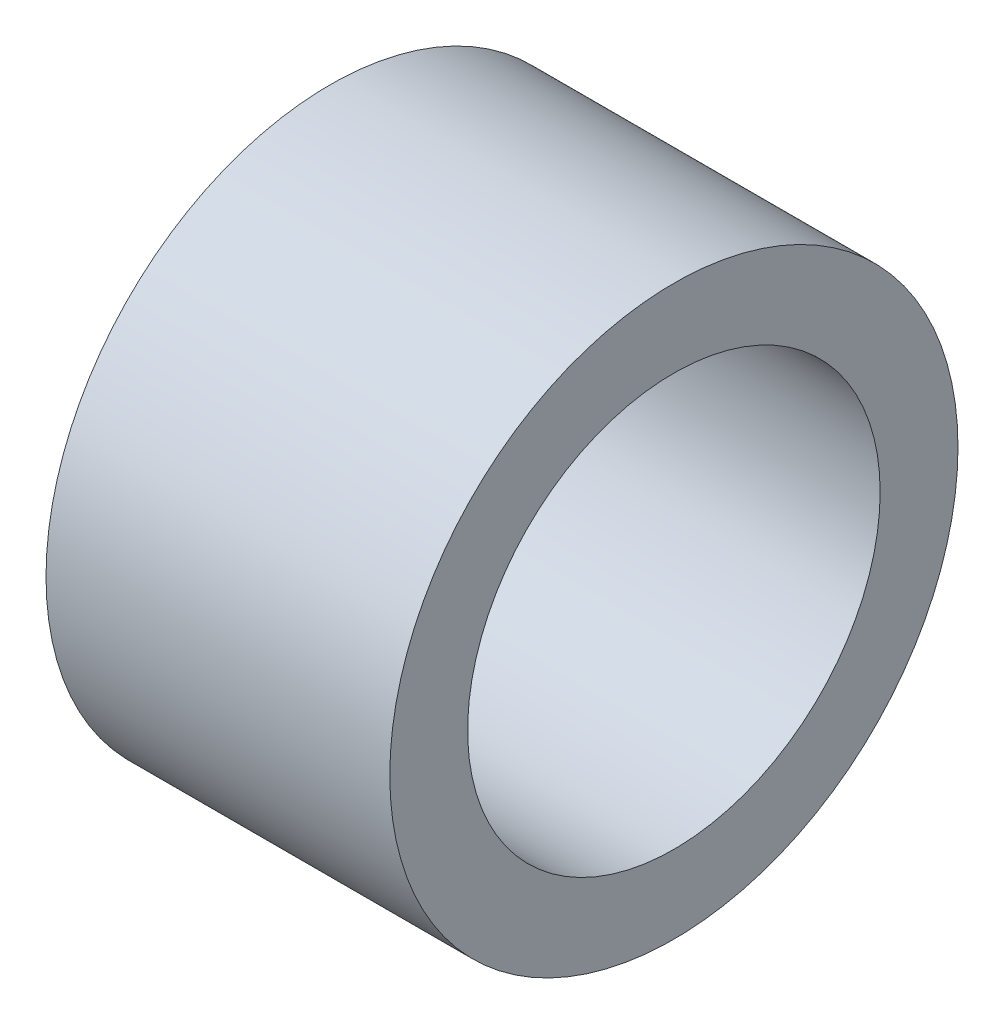
ISO-10303-21;
HEADER;
FILE_DESCRIPTION(('STEP AP214'),'2;1');
FILE_NAME('part.step','',(''),(''),'','','');
FILE_SCHEMA(('AUTOMOTIVE_DESIGN { 1 0 10303 214 1 1 1 1 }'));
ENDSEC;
DATA;
#1=APPLICATION_CONTEXT('core data for automotive mechanical design processes');
#2=APPLICATION_PROTOCOL_DEFINITION('international standard','automotive_design',2000,#1);
#3=PRODUCT_CONTEXT('',#1,'mechanical');
#4=PRODUCT('Part','Part','',(#3));
#5=PRODUCT_RELATED_PRODUCT_CATEGORY('part','',(#4));
#6=PRODUCT_DEFINITION_FORMATION('','',#4);
#7=PRODUCT_DEFINITION_CONTEXT('part definition',#1,'design');
#8=PRODUCT_DEFINITION('design','',#6,#7);
#9=PRODUCT_DEFINITION_SHAPE('','',#8);
#10=(LENGTH_UNIT() NAMED_UNIT(*) SI_UNIT(.MILLI.,.METRE.));
#11=(NAMED_UNIT(*) PLANE_ANGLE_UNIT() SI_UNIT($,.RADIAN.));
#12=(NAMED_UNIT(*) SI_UNIT($,.STERADIAN.) SOLID_ANGLE_UNIT());
#13=UNCERTAINTY_MEASURE_WITH_UNIT(LENGTH_MEASURE(1.E-05),#10,'distance_accuracy_value','');
#14=(GEOMETRIC_REPRESENTATION_CONTEXT(3) GLOBAL_UNCERTAINTY_ASSIGNED_CONTEXT((#13)) GLOBAL_UNIT_ASSIGNED_CONTEXT((#10,
#11,#12)) REPRESENTATION_CONTEXT('',''));
#15=CARTESIAN_POINT('',(0.,0.,0.));
#16=DIRECTION('',(0.,0.,1.));
#17=DIRECTION('',(1.,0.,0.));
#18=AXIS2_PLACEMENT_3D('',#15,#16,#17);
#19=CARTESIAN_POINT('',(-38.0995604076552,0.,1.80411241501588E-13));
#20=DIRECTION('',(1.,0.,0.));
#21=DIRECTION('',(0.,0.,-1.));
#22=AXIS2_PLACEMENT_3D('',#19,#20,#21);
#23=CYLINDRICAL_SURFACE('',#22,19.05);
#24=CARTESIAN_POINT('',(-38.0995604076552,0.,1.80411241501588E-13));
#25=DIRECTION('',(1.,0.,0.));
#26=DIRECTION('',(0.,0.,-1.));
#27=AXIS2_PLACEMENT_3D('',#24,#25,#26);
#28=CIRCLE('',#27,19.05);
#29=CARTESIAN_POINT('',(-38.0995604076552,0.,-19.0499999999998));
#30=VERTEX_POINT('',#29);
#31=EDGE_CURVE('E26',#30,#30,#28,.T.);
#32=ORIENTED_EDGE('',*,*,#31,.F.);
#33=EDGE_LOOP('',(#32));
#34=FACE_BOUND('',#33,.T.);
#35=CARTESIAN_POINT('',(-6.34956040765517,0.,0.));
#36=DIRECTION('',(1.,0.,0.));
#37=DIRECTION('',(0.,0.,-1.));
#38=AXIS2_PLACEMENT_3D('',#35,#36,#37);
#39=CIRCLE('',#38,19.05);
#40=CARTESIAN_POINT('',(-6.34956040765522,0.,-19.0499999999999));
#41=VERTEX_POINT('',#40);
#42=EDGE_CURVE('E17',#41,#41,#39,.T.);
#43=ORIENTED_EDGE('',*,*,#42,.T.);
#44=EDGE_LOOP('',(#43));
#45=FACE_BOUND('',#44,.T.);
#46=ADVANCED_FACE('F14',(#34,#45),#23,.F.);
#47=CARTESIAN_POINT('',(-6.3495604076553,0.,0.));
#48=DIRECTION('',(-1.,0.,0.));
#49=DIRECTION('',(0.,0.,1.));
#50=AXIS2_PLACEMENT_3D('',#47,#48,#49);
#51=PLANE('',#50);
#52=CARTESIAN_POINT('',(-6.34956040765519,0.,0.));
#53=DIRECTION('',(1.,0.,0.));
#54=DIRECTION('',(0.,0.,-1.));
#55=AXIS2_PLACEMENT_3D('',#52,#53,#54);
#56=CIRCLE('',#55,26.2391579348585);
#57=CARTESIAN_POINT('',(-6.34956040765527,0.,-26.2391579348584));
#58=VERTEX_POINT('',#57);
#59=EDGE_CURVE('E21',#58,#58,#56,.F.);
#60=ORIENTED_EDGE('',*,*,#59,.F.);
#61=EDGE_LOOP('',(#60));
#62=FACE_BOUND('',#61,.T.);
#63=ORIENTED_EDGE('',*,*,#42,.F.);
#64=EDGE_LOOP('',(#63));
#65=FACE_BOUND('',#64,.T.);
#66=ADVANCED_FACE('F35',(#62,#65),#51,.F.);
#67=CARTESIAN_POINT('',(-38.0995604076553,0.,1.80477854883065E-13));
#68=DIRECTION('',(-1.,0.,0.));
#69=DIRECTION('',(0.,0.,1.));
#70=AXIS2_PLACEMENT_3D('',#67,#68,#69);
#71=PLANE('',#70);
#72=CARTESIAN_POINT('',(-38.0995604076553,0.,1.80477854883065E-13));
#73=DIRECTION('',(1.,0.,0.));
#74=DIRECTION('',(0.,0.,-1.));
#75=AXIS2_PLACEMENT_3D('',#72,#73,#74);
#76=CIRCLE('',#75,26.2391579348585);
#77=CARTESIAN_POINT('',(-38.0995604076553,0.,-26.2391579348583));
#78=VERTEX_POINT('',#77);
#79=EDGE_CURVE('E9',#78,#78,#76,.T.);
#80=ORIENTED_EDGE('',*,*,#79,.F.);
#81=EDGE_LOOP('',(#80));
#82=FACE_BOUND('',#81,.T.);
#83=ORIENTED_EDGE('',*,*,#31,.T.);
#84=EDGE_LOOP('',(#83));
#85=FACE_BOUND('',#84,.T.);
#86=ADVANCED_FACE('F37',(#82,#85),#71,.T.);
#87=CARTESIAN_POINT('',(-38.0995604076553,0.,1.80477854883065E-13));
#88=DIRECTION('',(1.,0.,0.));
#89=DIRECTION('',(0.,0.,-1.));
#90=AXIS2_PLACEMENT_3D('',#87,#88,#89);
#91=CYLINDRICAL_SURFACE('',#90,26.2391579348585);
#92=ORIENTED_EDGE('',*,*,#59,.T.);
#93=EDGE_LOOP('',(#92));
#94=FACE_BOUND('',#93,.T.);
#95=ORIENTED_EDGE('',*,*,#79,.T.);
#96=EDGE_LOOP('',(#95));
#97=FACE_BOUND('',#96,.T.);
#98=ADVANCED_FACE('F44',(#94,#97),#91,.T.);
#99=CLOSED_SHELL('',(#46,#66,#86,#98));
#100=MANIFOLD_SOLID_BREP('B1',#99);
#101=ADVANCED_BREP_SHAPE_REPRESENTATION('',(#18,#100),#14);
#102=SHAPE_DEFINITION_REPRESENTATION(#9,#101);
ENDSEC;
END-ISO-10303-21;
